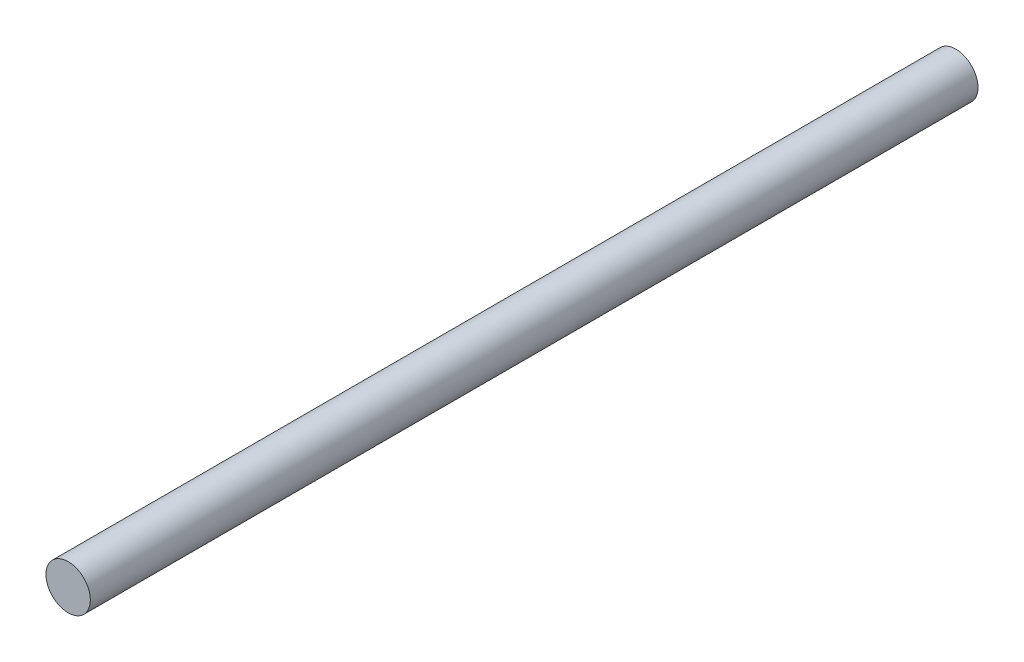
ISO-10303-21;
HEADER;
FILE_DESCRIPTION(('STEP AP214'),'2;1');
FILE_NAME('part.step','',(''),(''),'','','');
FILE_SCHEMA(('AUTOMOTIVE_DESIGN { 1 0 10303 214 1 1 1 1 }'));
ENDSEC;
DATA;
#1=APPLICATION_CONTEXT('core data for automotive mechanical design processes');
#2=APPLICATION_PROTOCOL_DEFINITION('international standard','automotive_design',2000,#1);
#3=PRODUCT_CONTEXT('',#1,'mechanical');
#4=PRODUCT('Part','Part','',(#3));
#5=PRODUCT_RELATED_PRODUCT_CATEGORY('part','',(#4));
#6=PRODUCT_DEFINITION_FORMATION('','',#4);
#7=PRODUCT_DEFINITION_CONTEXT('part definition',#1,'design');
#8=PRODUCT_DEFINITION('design','',#6,#7);
#9=PRODUCT_DEFINITION_SHAPE('','',#8);
#10=(LENGTH_UNIT() NAMED_UNIT(*) SI_UNIT(.MILLI.,.METRE.));
#11=(NAMED_UNIT(*) PLANE_ANGLE_UNIT() SI_UNIT($,.RADIAN.));
#12=(NAMED_UNIT(*) SI_UNIT($,.STERADIAN.) SOLID_ANGLE_UNIT());
#13=UNCERTAINTY_MEASURE_WITH_UNIT(LENGTH_MEASURE(1.E-05),#10,'distance_accuracy_value','');
#14=(GEOMETRIC_REPRESENTATION_CONTEXT(3) GLOBAL_UNCERTAINTY_ASSIGNED_CONTEXT((#13)) GLOBAL_UNIT_ASSIGNED_CONTEXT((#10,
#11,#12)) REPRESENTATION_CONTEXT('',''));
#15=CARTESIAN_POINT('',(0.,0.,0.));
#16=DIRECTION('',(0.,0.,1.));
#17=DIRECTION('',(1.,0.,0.));
#18=AXIS2_PLACEMENT_3D('',#15,#16,#17);
#19=CARTESIAN_POINT('',(0.,0.,127.));
#20=DIRECTION('',(0.,0.,-1.));
#21=DIRECTION('',(-1.,0.,0.));
#22=AXIS2_PLACEMENT_3D('',#19,#20,#21);
#23=CYLINDRICAL_SURFACE('',#22,3.175);
#24=CARTESIAN_POINT('',(0.,0.,127.));
#25=DIRECTION('',(0.,0.,1.));
#26=DIRECTION('',(1.,0.,0.));
#27=AXIS2_PLACEMENT_3D('',#24,#25,#26);
#28=CIRCLE('',#27,3.175);
#29=CARTESIAN_POINT('',(3.175,0.,127.));
#30=VERTEX_POINT('',#29);
#31=EDGE_CURVE('E10',#30,#30,#28,.T.);
#32=ORIENTED_EDGE('',*,*,#31,.F.);
#33=EDGE_LOOP('',(#32));
#34=FACE_BOUND('',#33,.T.);
#35=CARTESIAN_POINT('',(0.,0.,0.));
#36=DIRECTION('',(0.,0.,1.));
#37=DIRECTION('',(1.,0.,0.));
#38=AXIS2_PLACEMENT_3D('',#35,#36,#37);
#39=CIRCLE('',#38,3.175);
#40=CARTESIAN_POINT('',(3.175,0.,0.));
#41=VERTEX_POINT('',#40);
#42=EDGE_CURVE('E52',#41,#41,#39,.T.);
#43=ORIENTED_EDGE('',*,*,#42,.T.);
#44=EDGE_LOOP('',(#43));
#45=FACE_BOUND('',#44,.T.);
#46=ADVANCED_FACE('F49',(#34,#45),#23,.T.);
#47=CARTESIAN_POINT('',(0.,0.,127.));
#48=DIRECTION('',(0.,0.,1.));
#49=DIRECTION('',(1.,0.,0.));
#50=AXIS2_PLACEMENT_3D('',#47,#48,#49);
#51=PLANE('',#50);
#52=ORIENTED_EDGE('',*,*,#31,.T.);
#53=EDGE_LOOP('',(#52));
#54=FACE_BOUND('',#53,.T.);
#55=ADVANCED_FACE('F66',(#54),#51,.T.);
#56=CARTESIAN_POINT('',(0.,0.,0.));
#57=DIRECTION('',(0.,0.,1.));
#58=DIRECTION('',(1.,0.,0.));
#59=AXIS2_PLACEMENT_3D('',#56,#57,#58);
#60=PLANE('',#59);
#61=ORIENTED_EDGE('',*,*,#42,.F.);
#62=EDGE_LOOP('',(#61));
#63=FACE_BOUND('',#62,.T.);
#64=ADVANCED_FACE('F64',(#63),#60,.F.);
#65=CLOSED_SHELL('',(#46,#55,#64));
#66=MANIFOLD_SOLID_BREP('B2',#65);
#67=ADVANCED_BREP_SHAPE_REPRESENTATION('',(#18,#66),#14);
#68=SHAPE_DEFINITION_REPRESENTATION(#9,#67);
ENDSEC;
END-ISO-10303-21;
